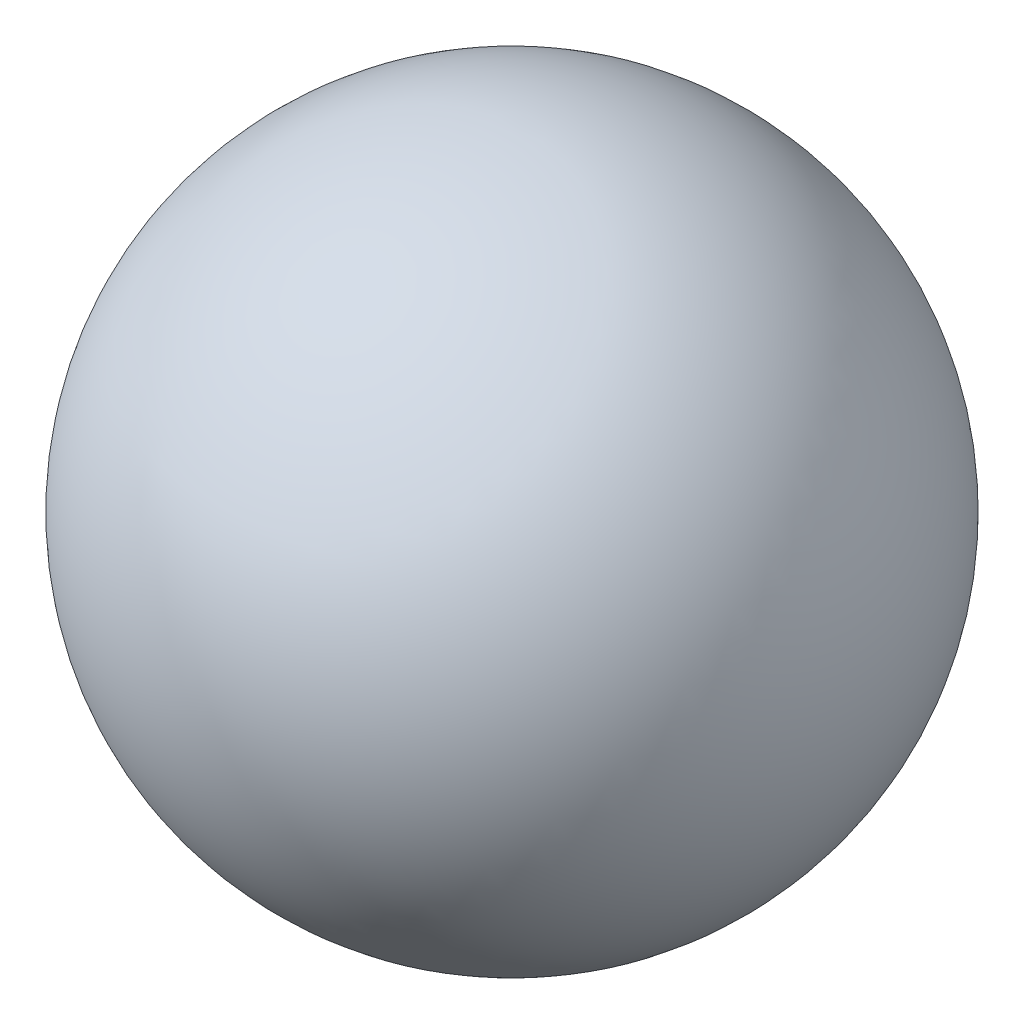
ISO-10303-21;
HEADER;
FILE_DESCRIPTION(('STEP AP214'),'2;1');
FILE_NAME('part.step','',(''),(''),'','','');
FILE_SCHEMA(('AUTOMOTIVE_DESIGN { 1 0 10303 214 1 1 1 1 }'));
ENDSEC;
DATA;
#1=APPLICATION_CONTEXT('core data for automotive mechanical design processes');
#2=APPLICATION_PROTOCOL_DEFINITION('international standard','automotive_design',2000,#1);
#3=PRODUCT_CONTEXT('',#1,'mechanical');
#4=PRODUCT('Part','Part','',(#3));
#5=PRODUCT_RELATED_PRODUCT_CATEGORY('part','',(#4));
#6=PRODUCT_DEFINITION_FORMATION('','',#4);
#7=PRODUCT_DEFINITION_CONTEXT('part definition',#1,'design');
#8=PRODUCT_DEFINITION('design','',#6,#7);
#9=PRODUCT_DEFINITION_SHAPE('','',#8);
#10=(LENGTH_UNIT() NAMED_UNIT(*) SI_UNIT(.MILLI.,.METRE.));
#11=(NAMED_UNIT(*) PLANE_ANGLE_UNIT() SI_UNIT($,.RADIAN.));
#12=(NAMED_UNIT(*) SI_UNIT($,.STERADIAN.) SOLID_ANGLE_UNIT());
#13=UNCERTAINTY_MEASURE_WITH_UNIT(LENGTH_MEASURE(1.E-05),#10,'distance_accuracy_value','');
#14=(GEOMETRIC_REPRESENTATION_CONTEXT(3) GLOBAL_UNCERTAINTY_ASSIGNED_CONTEXT((#13)) GLOBAL_UNIT_ASSIGNED_CONTEXT((#10,
#11,#12)) REPRESENTATION_CONTEXT('',''));
#15=CARTESIAN_POINT('',(0.,0.,0.));
#16=DIRECTION('',(0.,0.,1.));
#17=DIRECTION('',(1.,0.,0.));
#18=AXIS2_PLACEMENT_3D('',#15,#16,#17);
#19=CARTESIAN_POINT('',(0.,0.,0.));
#20=DIRECTION('',(0.,-1.,0.));
#21=DIRECTION('',(-1.,0.,0.));
#22=AXIS2_PLACEMENT_3D('',#19,#20,#21);
#23=SPHERICAL_SURFACE('',#22,6.325);
#24=CARTESIAN_POINT('',(0.,-6.325,0.));
#25=VERTEX_POINT('',#24);
#26=VERTEX_LOOP('',#25);
#27=FACE_BOUND('',#26,.T.);
#28=ADVANCED_FACE('F31',(#27),#23,.T.);
#29=CLOSED_SHELL('',(#28));
#30=MANIFOLD_SOLID_BREP('B2',#29);
#31=ADVANCED_BREP_SHAPE_REPRESENTATION('',(#18,#30),#14);
#32=SHAPE_DEFINITION_REPRESENTATION(#9,#31);
ENDSEC;
END-ISO-10303-21;
